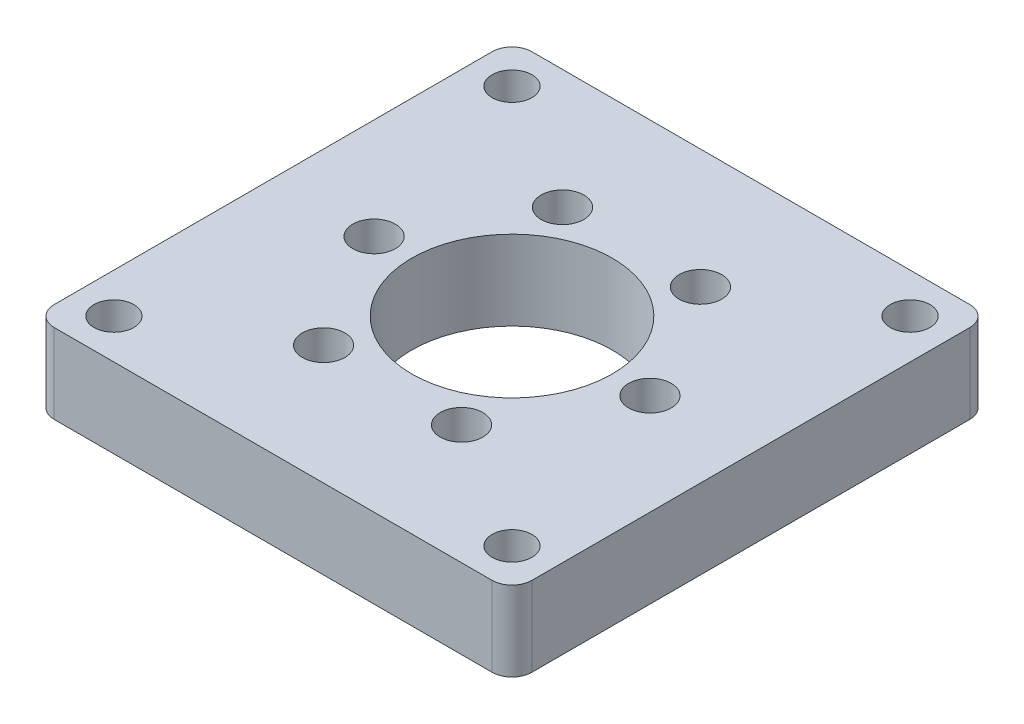
ISO-10303-21;
HEADER;
FILE_DESCRIPTION(('STEP AP214'),'2;1');
FILE_NAME('part.step','',(''),(''),'','','');
FILE_SCHEMA(('AUTOMOTIVE_DESIGN { 1 0 10303 214 1 1 1 1 }'));
ENDSEC;
DATA;
#1=APPLICATION_CONTEXT('core data for automotive mechanical design processes');
#2=APPLICATION_PROTOCOL_DEFINITION('international standard','automotive_design',2000,#1);
#3=PRODUCT_CONTEXT('',#1,'mechanical');
#4=PRODUCT('Part','Part','',(#3));
#5=PRODUCT_RELATED_PRODUCT_CATEGORY('part','',(#4));
#6=PRODUCT_DEFINITION_FORMATION('','',#4);
#7=PRODUCT_DEFINITION_CONTEXT('part definition',#1,'design');
#8=PRODUCT_DEFINITION('design','',#6,#7);
#9=PRODUCT_DEFINITION_SHAPE('','',#8);
#10=(LENGTH_UNIT() NAMED_UNIT(*) SI_UNIT(.MILLI.,.METRE.));
#11=(NAMED_UNIT(*) PLANE_ANGLE_UNIT() SI_UNIT($,.RADIAN.));
#12=(NAMED_UNIT(*) SI_UNIT($,.STERADIAN.) SOLID_ANGLE_UNIT());
#13=UNCERTAINTY_MEASURE_WITH_UNIT(LENGTH_MEASURE(1.E-05),#10,'distance_accuracy_value','');
#14=(GEOMETRIC_REPRESENTATION_CONTEXT(3) GLOBAL_UNCERTAINTY_ASSIGNED_CONTEXT((#13)) GLOBAL_UNIT_ASSIGNED_CONTEXT((#10,
#11,#12)) REPRESENTATION_CONTEXT('',''));
#15=CARTESIAN_POINT('',(0.,0.,0.));
#16=DIRECTION('',(0.,0.,1.));
#17=DIRECTION('',(1.,0.,0.));
#18=AXIS2_PLACEMENT_3D('',#15,#16,#17);
#19=CARTESIAN_POINT('',(0.,6.35,0.));
#20=DIRECTION('',(-1.,0.,0.));
#21=DIRECTION('',(0.,0.,1.));
#22=AXIS2_PLACEMENT_3D('',#19,#20,#21);
#23=PLANE('',#22);
#24=DIRECTION('',(0.,0.,-1.));
#25=VECTOR('',#24,1.);
#26=CARTESIAN_POINT('',(0.,6.35,0.));
#27=LINE('',#26,#25);
#28=CARTESIAN_POINT('',(0.,6.35,36.5125));
#29=VERTEX_POINT('',#28);
#30=CARTESIAN_POINT('',(0.,6.35,1.5875));
#31=VERTEX_POINT('',#30);
#32=EDGE_CURVE('E118',#29,#31,#27,.T.);
#33=ORIENTED_EDGE('',*,*,#32,.F.);
#34=DIRECTION('',(0.,-1.,0.));
#35=VECTOR('',#34,1.);
#36=CARTESIAN_POINT('',(0.,6.35,36.5125));
#37=LINE('',#36,#35);
#38=CARTESIAN_POINT('',(0.,0.,36.5125));
#39=VERTEX_POINT('',#38);
#40=EDGE_CURVE('E103',#29,#39,#37,.T.);
#41=ORIENTED_EDGE('',*,*,#40,.T.);
#42=DIRECTION('',(0.,0.,-1.));
#43=VECTOR('',#42,1.);
#44=CARTESIAN_POINT('',(0.,0.,0.));
#45=LINE('',#44,#43);
#46=CARTESIAN_POINT('',(0.,0.,1.5875));
#47=VERTEX_POINT('',#46);
#48=EDGE_CURVE('E115',#39,#47,#45,.T.);
#49=ORIENTED_EDGE('',*,*,#48,.T.);
#50=DIRECTION('',(0.,-1.,0.));
#51=VECTOR('',#50,1.);
#52=CARTESIAN_POINT('',(0.,6.35,1.5875));
#53=LINE('',#52,#51);
#54=EDGE_CURVE('E120',#47,#31,#53,.F.);
#55=ORIENTED_EDGE('',*,*,#54,.T.);
#56=EDGE_LOOP('',(#33,#41,#49,#55));
#57=FACE_BOUND('',#56,.T.);
#58=ADVANCED_FACE('F32',(#57),#23,.F.);
#59=CARTESIAN_POINT('',(0.,6.35,0.));
#60=DIRECTION('',(0.,0.,1.));
#61=DIRECTION('',(1.,0.,0.));
#62=AXIS2_PLACEMENT_3D('',#59,#60,#61);
#63=PLANE('',#62);
#64=DIRECTION('',(-1.,0.,0.));
#65=VECTOR('',#64,1.);
#66=CARTESIAN_POINT('',(0.,6.35,0.));
#67=LINE('',#66,#65);
#68=CARTESIAN_POINT('',(-1.5875,6.35,0.));
#69=VERTEX_POINT('',#68);
#70=CARTESIAN_POINT('',(-36.5125,6.35,0.));
#71=VERTEX_POINT('',#70);
#72=EDGE_CURVE('E162',#69,#71,#67,.T.);
#73=ORIENTED_EDGE('',*,*,#72,.F.);
#74=DIRECTION('',(0.,-1.,0.));
#75=VECTOR('',#74,1.);
#76=CARTESIAN_POINT('',(-1.5875,6.35,0.));
#77=LINE('',#76,#75);
#78=CARTESIAN_POINT('',(-1.5875,0.,0.));
#79=VERTEX_POINT('',#78);
#80=EDGE_CURVE('E11',#69,#79,#77,.T.);
#81=ORIENTED_EDGE('',*,*,#80,.T.);
#82=DIRECTION('',(-1.,0.,0.));
#83=VECTOR('',#82,1.);
#84=CARTESIAN_POINT('',(0.,0.,0.));
#85=LINE('',#84,#83);
#86=CARTESIAN_POINT('',(-36.5125,0.,0.));
#87=VERTEX_POINT('',#86);
#88=EDGE_CURVE('E125',#79,#87,#85,.T.);
#89=ORIENTED_EDGE('',*,*,#88,.T.);
#90=DIRECTION('',(0.,-1.,0.));
#91=VECTOR('',#90,1.);
#92=CARTESIAN_POINT('',(-36.5125,6.35,0.));
#93=LINE('',#92,#91);
#94=EDGE_CURVE('E40',#87,#71,#93,.F.);
#95=ORIENTED_EDGE('',*,*,#94,.T.);
#96=EDGE_LOOP('',(#73,#81,#89,#95));
#97=FACE_BOUND('',#96,.T.);
#98=ADVANCED_FACE('F161',(#97),#63,.F.);
#99=CARTESIAN_POINT('',(-38.1,6.35,0.));
#100=DIRECTION('',(1.,0.,0.));
#101=DIRECTION('',(0.,0.,-1.));
#102=AXIS2_PLACEMENT_3D('',#99,#100,#101);
#103=PLANE('',#102);
#104=DIRECTION('',(0.,0.,1.));
#105=VECTOR('',#104,1.);
#106=CARTESIAN_POINT('',(-38.1,0.,0.));
#107=LINE('',#106,#105);
#108=CARTESIAN_POINT('',(-38.1,0.,1.5875));
#109=VERTEX_POINT('',#108);
#110=CARTESIAN_POINT('',(-38.1,0.,36.5125));
#111=VERTEX_POINT('',#110);
#112=EDGE_CURVE('E129',#109,#111,#107,.T.);
#113=ORIENTED_EDGE('',*,*,#112,.T.);
#114=DIRECTION('',(0.,-1.,0.));
#115=VECTOR('',#114,1.);
#116=CARTESIAN_POINT('',(-38.1,6.35,36.5125));
#117=LINE('',#116,#115);
#118=CARTESIAN_POINT('',(-38.1,6.35,36.5125));
#119=VERTEX_POINT('',#118);
#120=EDGE_CURVE('E47',#111,#119,#117,.F.);
#121=ORIENTED_EDGE('',*,*,#120,.T.);
#122=DIRECTION('',(0.,0.,1.));
#123=VECTOR('',#122,1.);
#124=CARTESIAN_POINT('',(-38.1,6.35,0.));
#125=LINE('',#124,#123);
#126=CARTESIAN_POINT('',(-38.1,6.35,1.5875));
#127=VERTEX_POINT('',#126);
#128=EDGE_CURVE('E168',#127,#119,#125,.T.);
#129=ORIENTED_EDGE('',*,*,#128,.F.);
#130=DIRECTION('',(0.,-1.,0.));
#131=VECTOR('',#130,1.);
#132=CARTESIAN_POINT('',(-38.1,6.35,1.5875));
#133=LINE('',#132,#131);
#134=EDGE_CURVE('E155',#127,#109,#133,.T.);
#135=ORIENTED_EDGE('',*,*,#134,.T.);
#136=EDGE_LOOP('',(#113,#121,#129,#135));
#137=FACE_BOUND('',#136,.T.);
#138=ADVANCED_FACE('F172',(#137),#103,.F.);
#139=CARTESIAN_POINT('',(0.,6.35,38.1));
#140=DIRECTION('',(0.,0.,-1.));
#141=DIRECTION('',(-1.,0.,0.));
#142=AXIS2_PLACEMENT_3D('',#139,#140,#141);
#143=PLANE('',#142);
#144=DIRECTION('',(1.,0.,0.));
#145=VECTOR('',#144,1.);
#146=CARTESIAN_POINT('',(0.,0.,38.1));
#147=LINE('',#146,#145);
#148=CARTESIAN_POINT('',(-36.5125,0.,38.1));
#149=VERTEX_POINT('',#148);
#150=CARTESIAN_POINT('',(-1.58749999999999,0.,38.1));
#151=VERTEX_POINT('',#150);
#152=EDGE_CURVE('E139',#149,#151,#147,.T.);
#153=ORIENTED_EDGE('',*,*,#152,.T.);
#154=DIRECTION('',(0.,-1.,0.));
#155=VECTOR('',#154,1.);
#156=CARTESIAN_POINT('',(-1.58749999999999,6.35,38.1));
#157=LINE('',#156,#155);
#158=CARTESIAN_POINT('',(-1.58749999999999,6.35,38.1));
#159=VERTEX_POINT('',#158);
#160=EDGE_CURVE('E104',#151,#159,#157,.F.);
#161=ORIENTED_EDGE('',*,*,#160,.T.);
#162=DIRECTION('',(1.,0.,0.));
#163=VECTOR('',#162,1.);
#164=CARTESIAN_POINT('',(0.,6.35,38.1));
#165=LINE('',#164,#163);
#166=CARTESIAN_POINT('',(-36.5125,6.35,38.1));
#167=VERTEX_POINT('',#166);
#168=EDGE_CURVE('E135',#167,#159,#165,.T.);
#169=ORIENTED_EDGE('',*,*,#168,.F.);
#170=DIRECTION('',(0.,-1.,0.));
#171=VECTOR('',#170,1.);
#172=CARTESIAN_POINT('',(-36.5125,6.35,38.1));
#173=LINE('',#172,#171);
#174=EDGE_CURVE('E109',#167,#149,#173,.T.);
#175=ORIENTED_EDGE('',*,*,#174,.T.);
#176=EDGE_LOOP('',(#153,#161,#169,#175));
#177=FACE_BOUND('',#176,.T.);
#178=ADVANCED_FACE('F179',(#177),#143,.F.);
#179=CARTESIAN_POINT('',(0.,6.35,38.1));
#180=DIRECTION('',(0.,-1.,0.));
#181=DIRECTION('',(0.,0.,-1.));
#182=AXIS2_PLACEMENT_3D('',#179,#180,#181);
#183=PLANE('',#182);
#184=CARTESIAN_POINT('',(-34.925,6.35,34.925));
#185=DIRECTION('',(0.,1.,0.));
#186=DIRECTION('',(0.,0.,-1.));
#187=AXIS2_PLACEMENT_3D('',#184,#185,#186);
#188=CIRCLE('',#187,1.5875);
#189=CARTESIAN_POINT('',(-34.925,6.35,33.3375));
#190=VERTEX_POINT('',#189);
#191=EDGE_CURVE('E239',#190,#190,#188,.T.);
#192=ORIENTED_EDGE('',*,*,#191,.F.);
#193=EDGE_LOOP('',(#192));
#194=FACE_BOUND('',#193,.T.);
#195=CARTESIAN_POINT('',(-3.17499999999999,6.35,34.925));
#196=DIRECTION('',(0.,1.,0.));
#197=DIRECTION('',(0.,0.,1.));
#198=AXIS2_PLACEMENT_3D('',#195,#196,#197);
#199=CIRCLE('',#198,1.5875);
#200=CARTESIAN_POINT('',(-3.17499999999999,6.35,36.5125));
#201=VERTEX_POINT('',#200);
#202=EDGE_CURVE('E233',#201,#201,#199,.T.);
#203=ORIENTED_EDGE('',*,*,#202,.F.);
#204=EDGE_LOOP('',(#203));
#205=FACE_BOUND('',#204,.T.);
#206=CARTESIAN_POINT('',(-3.17499999999999,6.35,3.175));
#207=DIRECTION('',(0.,1.,0.));
#208=DIRECTION('',(0.,0.,-1.));
#209=AXIS2_PLACEMENT_3D('',#206,#207,#208);
#210=CIRCLE('',#209,1.5875);
#211=CARTESIAN_POINT('',(-3.17499999999999,6.35,1.5875));
#212=VERTEX_POINT('',#211);
#213=EDGE_CURVE('E227',#212,#212,#210,.T.);
#214=ORIENTED_EDGE('',*,*,#213,.F.);
#215=EDGE_LOOP('',(#214));
#216=FACE_BOUND('',#215,.T.);
#217=CARTESIAN_POINT('',(-34.925,6.35,3.175));
#218=DIRECTION('',(0.,1.,0.));
#219=DIRECTION('',(0.,0.,1.));
#220=AXIS2_PLACEMENT_3D('',#217,#218,#219);
#221=CIRCLE('',#220,1.5875);
#222=CARTESIAN_POINT('',(-34.925,6.35,4.7625));
#223=VERTEX_POINT('',#222);
#224=EDGE_CURVE('E221',#223,#223,#221,.T.);
#225=ORIENTED_EDGE('',*,*,#224,.F.);
#226=EDGE_LOOP('',(#225));
#227=FACE_BOUND('',#226,.T.);
#228=CARTESIAN_POINT('',(-30.05074,6.35,19.05));
#229=DIRECTION('',(0.,1.,0.));
#230=DIRECTION('',(0.,0.,1.));
#231=AXIS2_PLACEMENT_3D('',#228,#229,#230);
#232=CIRCLE('',#231,1.7);
#233=CARTESIAN_POINT('',(-30.05074,6.35,20.75));
#234=VERTEX_POINT('',#233);
#235=EDGE_CURVE('E217',#234,#234,#232,.T.);
#236=ORIENTED_EDGE('',*,*,#235,.F.);
#237=EDGE_LOOP('',(#236));
#238=FACE_BOUND('',#237,.T.);
#239=CARTESIAN_POINT('',(-24.55037,6.35,9.52307969957237));
#240=DIRECTION('',(0.,1.,0.));
#241=DIRECTION('',(0.,0.,1.));
#242=AXIS2_PLACEMENT_3D('',#239,#240,#241);
#243=CIRCLE('',#242,1.7);
#244=CARTESIAN_POINT('',(-24.55037,6.35,11.2230796995724));
#245=VERTEX_POINT('',#244);
#246=EDGE_CURVE('E211',#245,#245,#243,.T.);
#247=ORIENTED_EDGE('',*,*,#246,.F.);
#248=EDGE_LOOP('',(#247));
#249=FACE_BOUND('',#248,.T.);
#250=CARTESIAN_POINT('',(-13.54963,6.35,9.52307969957237));
#251=DIRECTION('',(0.,1.,0.));
#252=DIRECTION('',(0.,0.,1.));
#253=AXIS2_PLACEMENT_3D('',#250,#251,#252);
#254=CIRCLE('',#253,1.7);
#255=CARTESIAN_POINT('',(-13.54963,6.35,11.2230796995724));
#256=VERTEX_POINT('',#255);
#257=EDGE_CURVE('E205',#256,#256,#254,.T.);
#258=ORIENTED_EDGE('',*,*,#257,.F.);
#259=EDGE_LOOP('',(#258));
#260=FACE_BOUND('',#259,.T.);
#261=CARTESIAN_POINT('',(-8.04925999999999,6.35,19.05));
#262=DIRECTION('',(0.,1.,0.));
#263=DIRECTION('',(0.,0.,1.));
#264=AXIS2_PLACEMENT_3D('',#261,#262,#263);
#265=CIRCLE('',#264,1.7);
#266=CARTESIAN_POINT('',(-8.04925999999999,6.35,20.75));
#267=VERTEX_POINT('',#266);
#268=EDGE_CURVE('E199',#267,#267,#265,.T.);
#269=ORIENTED_EDGE('',*,*,#268,.F.);
#270=EDGE_LOOP('',(#269));
#271=FACE_BOUND('',#270,.T.);
#272=CARTESIAN_POINT('',(-13.54963,6.35,28.5769203004276));
#273=DIRECTION('',(0.,1.,0.));
#274=DIRECTION('',(0.,0.,1.));
#275=AXIS2_PLACEMENT_3D('',#272,#273,#274);
#276=CIRCLE('',#275,1.7);
#277=CARTESIAN_POINT('',(-13.54963,6.35,30.2769203004276));
#278=VERTEX_POINT('',#277);
#279=EDGE_CURVE('E193',#278,#278,#276,.T.);
#280=ORIENTED_EDGE('',*,*,#279,.F.);
#281=EDGE_LOOP('',(#280));
#282=FACE_BOUND('',#281,.T.);
#283=CARTESIAN_POINT('',(-24.55037,6.35,28.5769203004276));
#284=DIRECTION('',(0.,1.,0.));
#285=DIRECTION('',(0.,0.,1.));
#286=AXIS2_PLACEMENT_3D('',#283,#284,#285);
#287=CIRCLE('',#286,1.7);
#288=CARTESIAN_POINT('',(-24.55037,6.35,30.2769203004276));
#289=VERTEX_POINT('',#288);
#290=EDGE_CURVE('E187',#289,#289,#287,.T.);
#291=ORIENTED_EDGE('',*,*,#290,.F.);
#292=EDGE_LOOP('',(#291));
#293=FACE_BOUND('',#292,.T.);
#294=CARTESIAN_POINT('',(-19.05,6.35,19.05));
#295=DIRECTION('',(0.,1.,0.));
#296=DIRECTION('',(0.,0.,1.));
#297=AXIS2_PLACEMENT_3D('',#294,#295,#296);
#298=CIRCLE('',#297,8.);
#299=CARTESIAN_POINT('',(-19.05,6.35,27.05));
#300=VERTEX_POINT('',#299);
#301=EDGE_CURVE('E132',#300,#300,#298,.T.);
#302=ORIENTED_EDGE('',*,*,#301,.F.);
#303=EDGE_LOOP('',(#302));
#304=FACE_BOUND('',#303,.T.);
#305=ORIENTED_EDGE('',*,*,#168,.T.);
#306=CARTESIAN_POINT('',(-1.58749999999999,6.35,36.5125));
#307=DIRECTION('',(0.,-1.,0.));
#308=DIRECTION('',(0.,0.,-1.));
#309=AXIS2_PLACEMENT_3D('',#306,#307,#308);
#310=CIRCLE('',#309,1.5875);
#311=EDGE_CURVE('E153',#159,#29,#310,.F.);
#312=ORIENTED_EDGE('',*,*,#311,.T.);
#313=ORIENTED_EDGE('',*,*,#32,.T.);
#314=CARTESIAN_POINT('',(-1.5875,6.35,1.5875));
#315=DIRECTION('',(0.,-1.,0.));
#316=DIRECTION('',(0.,0.,-1.));
#317=AXIS2_PLACEMENT_3D('',#314,#315,#316);
#318=CIRCLE('',#317,1.5875);
#319=EDGE_CURVE('E149',#31,#69,#318,.F.);
#320=ORIENTED_EDGE('',*,*,#319,.T.);
#321=ORIENTED_EDGE('',*,*,#72,.T.);
#322=CARTESIAN_POINT('',(-36.5125,6.35,1.5875));
#323=DIRECTION('',(0.,-1.,0.));
#324=DIRECTION('',(0.,0.,-1.));
#325=AXIS2_PLACEMENT_3D('',#322,#323,#324);
#326=CIRCLE('',#325,1.5875);
#327=EDGE_CURVE('E54',#71,#127,#326,.F.);
#328=ORIENTED_EDGE('',*,*,#327,.T.);
#329=ORIENTED_EDGE('',*,*,#128,.T.);
#330=CARTESIAN_POINT('',(-36.5125,6.35,36.5125));
#331=DIRECTION('',(0.,-1.,0.));
#332=DIRECTION('',(0.,0.,-1.));
#333=AXIS2_PLACEMENT_3D('',#330,#331,#332);
#334=CIRCLE('',#333,1.5875);
#335=EDGE_CURVE('E151',#119,#167,#334,.F.);
#336=ORIENTED_EDGE('',*,*,#335,.T.);
#337=EDGE_LOOP('',(#305,#312,#313,#320,#321,#328,#329,#336));
#338=FACE_BOUND('',#337,.T.);
#339=ADVANCED_FACE('F166',(#194,#205,#216,#227,#238,#249,#260,#271,#282,#293,#304,#338),#183,.F.);
#340=CARTESIAN_POINT('',(0.,0.,38.1));
#341=DIRECTION('',(0.,-1.,0.));
#342=DIRECTION('',(0.,0.,-1.));
#343=AXIS2_PLACEMENT_3D('',#340,#341,#342);
#344=PLANE('',#343);
#345=CARTESIAN_POINT('',(-34.925,0.,34.925));
#346=DIRECTION('',(0.,1.,0.));
#347=DIRECTION('',(0.,0.,-1.));
#348=AXIS2_PLACEMENT_3D('',#345,#346,#347);
#349=CIRCLE('',#348,1.5875);
#350=CARTESIAN_POINT('',(-34.925,0.,33.3375));
#351=VERTEX_POINT('',#350);
#352=EDGE_CURVE('E236',#351,#351,#349,.T.);
#353=ORIENTED_EDGE('',*,*,#352,.T.);
#354=EDGE_LOOP('',(#353));
#355=FACE_BOUND('',#354,.T.);
#356=CARTESIAN_POINT('',(-3.17499999999999,0.,34.925));
#357=DIRECTION('',(0.,1.,0.));
#358=DIRECTION('',(0.,0.,1.));
#359=AXIS2_PLACEMENT_3D('',#356,#357,#358);
#360=CIRCLE('',#359,1.5875);
#361=CARTESIAN_POINT('',(-3.17499999999999,0.,36.5125));
#362=VERTEX_POINT('',#361);
#363=EDGE_CURVE('E230',#362,#362,#360,.T.);
#364=ORIENTED_EDGE('',*,*,#363,.T.);
#365=EDGE_LOOP('',(#364));
#366=FACE_BOUND('',#365,.T.);
#367=CARTESIAN_POINT('',(-3.17499999999999,0.,3.175));
#368=DIRECTION('',(0.,1.,0.));
#369=DIRECTION('',(0.,0.,-1.));
#370=AXIS2_PLACEMENT_3D('',#367,#368,#369);
#371=CIRCLE('',#370,1.5875);
#372=CARTESIAN_POINT('',(-3.17499999999999,0.,1.5875));
#373=VERTEX_POINT('',#372);
#374=EDGE_CURVE('E224',#373,#373,#371,.T.);
#375=ORIENTED_EDGE('',*,*,#374,.T.);
#376=EDGE_LOOP('',(#375));
#377=FACE_BOUND('',#376,.T.);
#378=CARTESIAN_POINT('',(-34.925,0.,3.175));
#379=DIRECTION('',(0.,1.,0.));
#380=DIRECTION('',(0.,0.,1.));
#381=AXIS2_PLACEMENT_3D('',#378,#379,#380);
#382=CIRCLE('',#381,1.5875);
#383=CARTESIAN_POINT('',(-34.925,0.,4.7625));
#384=VERTEX_POINT('',#383);
#385=EDGE_CURVE('E220',#384,#384,#382,.T.);
#386=ORIENTED_EDGE('',*,*,#385,.T.);
#387=EDGE_LOOP('',(#386));
#388=FACE_BOUND('',#387,.T.);
#389=CARTESIAN_POINT('',(-30.05074,0.,19.05));
#390=DIRECTION('',(0.,1.,0.));
#391=DIRECTION('',(0.,0.,1.));
#392=AXIS2_PLACEMENT_3D('',#389,#390,#391);
#393=CIRCLE('',#392,1.7);
#394=CARTESIAN_POINT('',(-30.05074,0.,20.75));
#395=VERTEX_POINT('',#394);
#396=EDGE_CURVE('E214',#395,#395,#393,.T.);
#397=ORIENTED_EDGE('',*,*,#396,.T.);
#398=EDGE_LOOP('',(#397));
#399=FACE_BOUND('',#398,.T.);
#400=CARTESIAN_POINT('',(-24.55037,0.,9.52307969957237));
#401=DIRECTION('',(0.,1.,0.));
#402=DIRECTION('',(0.,0.,1.));
#403=AXIS2_PLACEMENT_3D('',#400,#401,#402);
#404=CIRCLE('',#403,1.7);
#405=CARTESIAN_POINT('',(-24.55037,0.,11.2230796995724));
#406=VERTEX_POINT('',#405);
#407=EDGE_CURVE('E208',#406,#406,#404,.T.);
#408=ORIENTED_EDGE('',*,*,#407,.T.);
#409=EDGE_LOOP('',(#408));
#410=FACE_BOUND('',#409,.T.);
#411=CARTESIAN_POINT('',(-13.54963,0.,9.52307969957237));
#412=DIRECTION('',(0.,1.,0.));
#413=DIRECTION('',(0.,0.,1.));
#414=AXIS2_PLACEMENT_3D('',#411,#412,#413);
#415=CIRCLE('',#414,1.7);
#416=CARTESIAN_POINT('',(-13.54963,0.,11.2230796995724));
#417=VERTEX_POINT('',#416);
#418=EDGE_CURVE('E202',#417,#417,#415,.T.);
#419=ORIENTED_EDGE('',*,*,#418,.T.);
#420=EDGE_LOOP('',(#419));
#421=FACE_BOUND('',#420,.T.);
#422=CARTESIAN_POINT('',(-8.04925999999999,0.,19.05));
#423=DIRECTION('',(0.,1.,0.));
#424=DIRECTION('',(0.,0.,1.));
#425=AXIS2_PLACEMENT_3D('',#422,#423,#424);
#426=CIRCLE('',#425,1.7);
#427=CARTESIAN_POINT('',(-8.04925999999999,0.,20.75));
#428=VERTEX_POINT('',#427);
#429=EDGE_CURVE('E196',#428,#428,#426,.T.);
#430=ORIENTED_EDGE('',*,*,#429,.T.);
#431=EDGE_LOOP('',(#430));
#432=FACE_BOUND('',#431,.T.);
#433=CARTESIAN_POINT('',(-13.54963,0.,28.5769203004276));
#434=DIRECTION('',(0.,1.,0.));
#435=DIRECTION('',(0.,0.,1.));
#436=AXIS2_PLACEMENT_3D('',#433,#434,#435);
#437=CIRCLE('',#436,1.7);
#438=CARTESIAN_POINT('',(-13.54963,0.,30.2769203004276));
#439=VERTEX_POINT('',#438);
#440=EDGE_CURVE('E190',#439,#439,#437,.T.);
#441=ORIENTED_EDGE('',*,*,#440,.T.);
#442=EDGE_LOOP('',(#441));
#443=FACE_BOUND('',#442,.T.);
#444=CARTESIAN_POINT('',(-24.55037,0.,28.5769203004276));
#445=DIRECTION('',(0.,1.,0.));
#446=DIRECTION('',(0.,0.,1.));
#447=AXIS2_PLACEMENT_3D('',#444,#445,#446);
#448=CIRCLE('',#447,1.7);
#449=CARTESIAN_POINT('',(-24.55037,0.,30.2769203004276));
#450=VERTEX_POINT('',#449);
#451=EDGE_CURVE('E183',#450,#450,#448,.T.);
#452=ORIENTED_EDGE('',*,*,#451,.T.);
#453=EDGE_LOOP('',(#452));
#454=FACE_BOUND('',#453,.T.);
#455=CARTESIAN_POINT('',(-19.05,0.,19.05));
#456=DIRECTION('',(0.,1.,0.));
#457=DIRECTION('',(0.,0.,1.));
#458=AXIS2_PLACEMENT_3D('',#455,#456,#457);
#459=CIRCLE('',#458,8.);
#460=CARTESIAN_POINT('',(-19.05,0.,27.05));
#461=VERTEX_POINT('',#460);
#462=EDGE_CURVE('E126',#461,#461,#459,.T.);
#463=ORIENTED_EDGE('',*,*,#462,.T.);
#464=EDGE_LOOP('',(#463));
#465=FACE_BOUND('',#464,.T.);
#466=ORIENTED_EDGE('',*,*,#48,.F.);
#467=CARTESIAN_POINT('',(-1.58749999999999,0.,36.5125));
#468=DIRECTION('',(0.,-1.,0.));
#469=DIRECTION('',(0.,0.,-1.));
#470=AXIS2_PLACEMENT_3D('',#467,#468,#469);
#471=CIRCLE('',#470,1.5875);
#472=EDGE_CURVE('E99',#39,#151,#471,.T.);
#473=ORIENTED_EDGE('',*,*,#472,.T.);
#474=ORIENTED_EDGE('',*,*,#152,.F.);
#475=CARTESIAN_POINT('',(-36.5125,0.,36.5125));
#476=DIRECTION('',(0.,-1.,0.));
#477=DIRECTION('',(0.,0.,-1.));
#478=AXIS2_PLACEMENT_3D('',#475,#476,#477);
#479=CIRCLE('',#478,1.5875);
#480=EDGE_CURVE('E110',#149,#111,#479,.T.);
#481=ORIENTED_EDGE('',*,*,#480,.T.);
#482=ORIENTED_EDGE('',*,*,#112,.F.);
#483=CARTESIAN_POINT('',(-36.5125,0.,1.5875));
#484=DIRECTION('',(0.,-1.,0.));
#485=DIRECTION('',(0.,0.,-1.));
#486=AXIS2_PLACEMENT_3D('',#483,#484,#485);
#487=CIRCLE('',#486,1.5875);
#488=EDGE_CURVE('E119',#109,#87,#487,.T.);
#489=ORIENTED_EDGE('',*,*,#488,.T.);
#490=ORIENTED_EDGE('',*,*,#88,.F.);
#491=CARTESIAN_POINT('',(-1.5875,0.,1.5875));
#492=DIRECTION('',(0.,-1.,0.));
#493=DIRECTION('',(0.,0.,-1.));
#494=AXIS2_PLACEMENT_3D('',#491,#492,#493);
#495=CIRCLE('',#494,1.5875);
#496=EDGE_CURVE('E124',#79,#47,#495,.T.);
#497=ORIENTED_EDGE('',*,*,#496,.T.);
#498=EDGE_LOOP('',(#466,#473,#474,#481,#482,#489,#490,#497));
#499=FACE_BOUND('',#498,.T.);
#500=ADVANCED_FACE('F122',(#355,#366,#377,#388,#399,#410,#421,#432,#443,#454,#465,#499),#344,.T.);
#501=CARTESIAN_POINT('',(-19.05,0.,19.05));
#502=DIRECTION('',(0.,1.,0.));
#503=DIRECTION('',(0.,0.,1.));
#504=AXIS2_PLACEMENT_3D('',#501,#502,#503);
#505=CYLINDRICAL_SURFACE('',#504,8.);
#506=ORIENTED_EDGE('',*,*,#462,.F.);
#507=EDGE_LOOP('',(#506));
#508=FACE_BOUND('',#507,.T.);
#509=ORIENTED_EDGE('',*,*,#301,.T.);
#510=EDGE_LOOP('',(#509));
#511=FACE_BOUND('',#510,.T.);
#512=ADVANCED_FACE('F277',(#508,#511),#505,.F.);
#513=CARTESIAN_POINT('',(-24.55037,6.35,28.5769203004276));
#514=DIRECTION('',(0.,1.,0.));
#515=DIRECTION('',(0.,0.,1.));
#516=AXIS2_PLACEMENT_3D('',#513,#514,#515);
#517=CYLINDRICAL_SURFACE('',#516,1.7);
#518=ORIENTED_EDGE('',*,*,#451,.F.);
#519=EDGE_LOOP('',(#518));
#520=FACE_BOUND('',#519,.T.);
#521=ORIENTED_EDGE('',*,*,#290,.T.);
#522=EDGE_LOOP('',(#521));
#523=FACE_BOUND('',#522,.T.);
#524=ADVANCED_FACE('F279',(#520,#523),#517,.F.);
#525=CARTESIAN_POINT('',(-13.54963,6.35,28.5769203004276));
#526=DIRECTION('',(0.,1.,0.));
#527=DIRECTION('',(0.,0.,1.));
#528=AXIS2_PLACEMENT_3D('',#525,#526,#527);
#529=CYLINDRICAL_SURFACE('',#528,1.7);
#530=ORIENTED_EDGE('',*,*,#440,.F.);
#531=EDGE_LOOP('',(#530));
#532=FACE_BOUND('',#531,.T.);
#533=ORIENTED_EDGE('',*,*,#279,.T.);
#534=EDGE_LOOP('',(#533));
#535=FACE_BOUND('',#534,.T.);
#536=ADVANCED_FACE('F286',(#532,#535),#529,.F.);
#537=CARTESIAN_POINT('',(-8.04925999999999,6.35,19.05));
#538=DIRECTION('',(0.,1.,0.));
#539=DIRECTION('',(0.,0.,1.));
#540=AXIS2_PLACEMENT_3D('',#537,#538,#539);
#541=CYLINDRICAL_SURFACE('',#540,1.7);
#542=ORIENTED_EDGE('',*,*,#429,.F.);
#543=EDGE_LOOP('',(#542));
#544=FACE_BOUND('',#543,.T.);
#545=ORIENTED_EDGE('',*,*,#268,.T.);
#546=EDGE_LOOP('',(#545));
#547=FACE_BOUND('',#546,.T.);
#548=ADVANCED_FACE('F429',(#544,#547),#541,.F.);
#549=CARTESIAN_POINT('',(-13.54963,6.35,9.52307969957237));
#550=DIRECTION('',(0.,1.,0.));
#551=DIRECTION('',(0.,0.,1.));
#552=AXIS2_PLACEMENT_3D('',#549,#550,#551);
#553=CYLINDRICAL_SURFACE('',#552,1.7);
#554=ORIENTED_EDGE('',*,*,#418,.F.);
#555=EDGE_LOOP('',(#554));
#556=FACE_BOUND('',#555,.T.);
#557=ORIENTED_EDGE('',*,*,#257,.T.);
#558=EDGE_LOOP('',(#557));
#559=FACE_BOUND('',#558,.T.);
#560=ADVANCED_FACE('F419',(#556,#559),#553,.F.);
#561=CARTESIAN_POINT('',(-24.55037,6.35,9.52307969957237));
#562=DIRECTION('',(0.,1.,0.));
#563=DIRECTION('',(0.,0.,1.));
#564=AXIS2_PLACEMENT_3D('',#561,#562,#563);
#565=CYLINDRICAL_SURFACE('',#564,1.7);
#566=ORIENTED_EDGE('',*,*,#407,.F.);
#567=EDGE_LOOP('',(#566));
#568=FACE_BOUND('',#567,.T.);
#569=ORIENTED_EDGE('',*,*,#246,.T.);
#570=EDGE_LOOP('',(#569));
#571=FACE_BOUND('',#570,.T.);
#572=ADVANCED_FACE('F409',(#568,#571),#565,.F.);
#573=CARTESIAN_POINT('',(-30.05074,6.35,19.05));
#574=DIRECTION('',(0.,1.,0.));
#575=DIRECTION('',(0.,0.,1.));
#576=AXIS2_PLACEMENT_3D('',#573,#574,#575);
#577=CYLINDRICAL_SURFACE('',#576,1.7);
#578=ORIENTED_EDGE('',*,*,#396,.F.);
#579=EDGE_LOOP('',(#578));
#580=FACE_BOUND('',#579,.T.);
#581=ORIENTED_EDGE('',*,*,#235,.T.);
#582=EDGE_LOOP('',(#581));
#583=FACE_BOUND('',#582,.T.);
#584=ADVANCED_FACE('F399',(#580,#583),#577,.F.);
#585=CARTESIAN_POINT('',(-34.925,0.,3.175));
#586=DIRECTION('',(0.,1.,0.));
#587=DIRECTION('',(0.,0.,1.));
#588=AXIS2_PLACEMENT_3D('',#585,#586,#587);
#589=CYLINDRICAL_SURFACE('',#588,1.5875);
#590=ORIENTED_EDGE('',*,*,#385,.F.);
#591=EDGE_LOOP('',(#590));
#592=FACE_BOUND('',#591,.T.);
#593=ORIENTED_EDGE('',*,*,#224,.T.);
#594=EDGE_LOOP('',(#593));
#595=FACE_BOUND('',#594,.T.);
#596=ADVANCED_FACE('F389',(#592,#595),#589,.F.);
#597=CARTESIAN_POINT('',(-3.17499999999999,0.,3.175));
#598=DIRECTION('',(0.,1.,0.));
#599=DIRECTION('',(0.,0.,1.));
#600=AXIS2_PLACEMENT_3D('',#597,#598,#599);
#601=CYLINDRICAL_SURFACE('',#600,1.5875);
#602=ORIENTED_EDGE('',*,*,#374,.F.);
#603=EDGE_LOOP('',(#602));
#604=FACE_BOUND('',#603,.T.);
#605=ORIENTED_EDGE('',*,*,#213,.T.);
#606=EDGE_LOOP('',(#605));
#607=FACE_BOUND('',#606,.T.);
#608=ADVANCED_FACE('F379',(#604,#607),#601,.F.);
#609=CARTESIAN_POINT('',(-3.17499999999999,0.,34.925));
#610=DIRECTION('',(0.,1.,0.));
#611=DIRECTION('',(0.,0.,1.));
#612=AXIS2_PLACEMENT_3D('',#609,#610,#611);
#613=CYLINDRICAL_SURFACE('',#612,1.5875);
#614=ORIENTED_EDGE('',*,*,#363,.F.);
#615=EDGE_LOOP('',(#614));
#616=FACE_BOUND('',#615,.T.);
#617=ORIENTED_EDGE('',*,*,#202,.T.);
#618=EDGE_LOOP('',(#617));
#619=FACE_BOUND('',#618,.T.);
#620=ADVANCED_FACE('F250',(#616,#619),#613,.F.);
#621=CARTESIAN_POINT('',(-34.925,0.,34.925));
#622=DIRECTION('',(0.,1.,0.));
#623=DIRECTION('',(0.,0.,1.));
#624=AXIS2_PLACEMENT_3D('',#621,#622,#623);
#625=CYLINDRICAL_SURFACE('',#624,1.5875);
#626=ORIENTED_EDGE('',*,*,#352,.F.);
#627=EDGE_LOOP('',(#626));
#628=FACE_BOUND('',#627,.T.);
#629=ORIENTED_EDGE('',*,*,#191,.T.);
#630=EDGE_LOOP('',(#629));
#631=FACE_BOUND('',#630,.T.);
#632=ADVANCED_FACE('F247',(#628,#631),#625,.F.);
#633=CARTESIAN_POINT('',(-1.58749999999999,6.35,36.5125));
#634=DIRECTION('',(0.,-1.,0.));
#635=DIRECTION('',(0.,0.,-1.));
#636=AXIS2_PLACEMENT_3D('',#633,#634,#635);
#637=CYLINDRICAL_SURFACE('',#636,1.5875);
#638=ORIENTED_EDGE('',*,*,#311,.F.);
#639=ORIENTED_EDGE('',*,*,#160,.F.);
#640=ORIENTED_EDGE('',*,*,#472,.F.);
#641=ORIENTED_EDGE('',*,*,#40,.F.);
#642=EDGE_LOOP('',(#638,#639,#640,#641));
#643=FACE_BOUND('',#642,.T.);
#644=ADVANCED_FACE('F102',(#643),#637,.T.);
#645=CARTESIAN_POINT('',(-36.5125,6.35,36.5125));
#646=DIRECTION('',(0.,-1.,0.));
#647=DIRECTION('',(0.,0.,-1.));
#648=AXIS2_PLACEMENT_3D('',#645,#646,#647);
#649=CYLINDRICAL_SURFACE('',#648,1.5875);
#650=ORIENTED_EDGE('',*,*,#335,.F.);
#651=ORIENTED_EDGE('',*,*,#120,.F.);
#652=ORIENTED_EDGE('',*,*,#480,.F.);
#653=ORIENTED_EDGE('',*,*,#174,.F.);
#654=EDGE_LOOP('',(#650,#651,#652,#653));
#655=FACE_BOUND('',#654,.T.);
#656=ADVANCED_FACE('F176',(#655),#649,.T.);
#657=CARTESIAN_POINT('',(-1.5875,6.35,1.5875));
#658=DIRECTION('',(0.,-1.,0.));
#659=DIRECTION('',(0.,0.,-1.));
#660=AXIS2_PLACEMENT_3D('',#657,#658,#659);
#661=CYLINDRICAL_SURFACE('',#660,1.5875);
#662=ORIENTED_EDGE('',*,*,#319,.F.);
#663=ORIENTED_EDGE('',*,*,#54,.F.);
#664=ORIENTED_EDGE('',*,*,#496,.F.);
#665=ORIENTED_EDGE('',*,*,#80,.F.);
#666=EDGE_LOOP('',(#662,#663,#664,#665));
#667=FACE_BOUND('',#666,.T.);
#668=ADVANCED_FACE('F302',(#667),#661,.T.);
#669=CARTESIAN_POINT('',(-36.5125,6.35,1.5875));
#670=DIRECTION('',(0.,-1.,0.));
#671=DIRECTION('',(0.,0.,-1.));
#672=AXIS2_PLACEMENT_3D('',#669,#670,#671);
#673=CYLINDRICAL_SURFACE('',#672,1.5875);
#674=ORIENTED_EDGE('',*,*,#327,.F.);
#675=ORIENTED_EDGE('',*,*,#94,.F.);
#676=ORIENTED_EDGE('',*,*,#488,.F.);
#677=ORIENTED_EDGE('',*,*,#134,.F.);
#678=EDGE_LOOP('',(#674,#675,#676,#677));
#679=FACE_BOUND('',#678,.T.);
#680=ADVANCED_FACE('F34',(#679),#673,.T.);
#681=CLOSED_SHELL('',(#58,#98,#138,#178,#339,#500,#512,#524,#536,#548,#560,#572,#584,#596,#608,
#620,#632,#644,#656,#668,#680));
#682=MANIFOLD_SOLID_BREP('B2',#681);
#683=ADVANCED_BREP_SHAPE_REPRESENTATION('',(#18,#682),#14);
#684=SHAPE_DEFINITION_REPRESENTATION(#9,#683);
ENDSEC;
END-ISO-10303-21;
